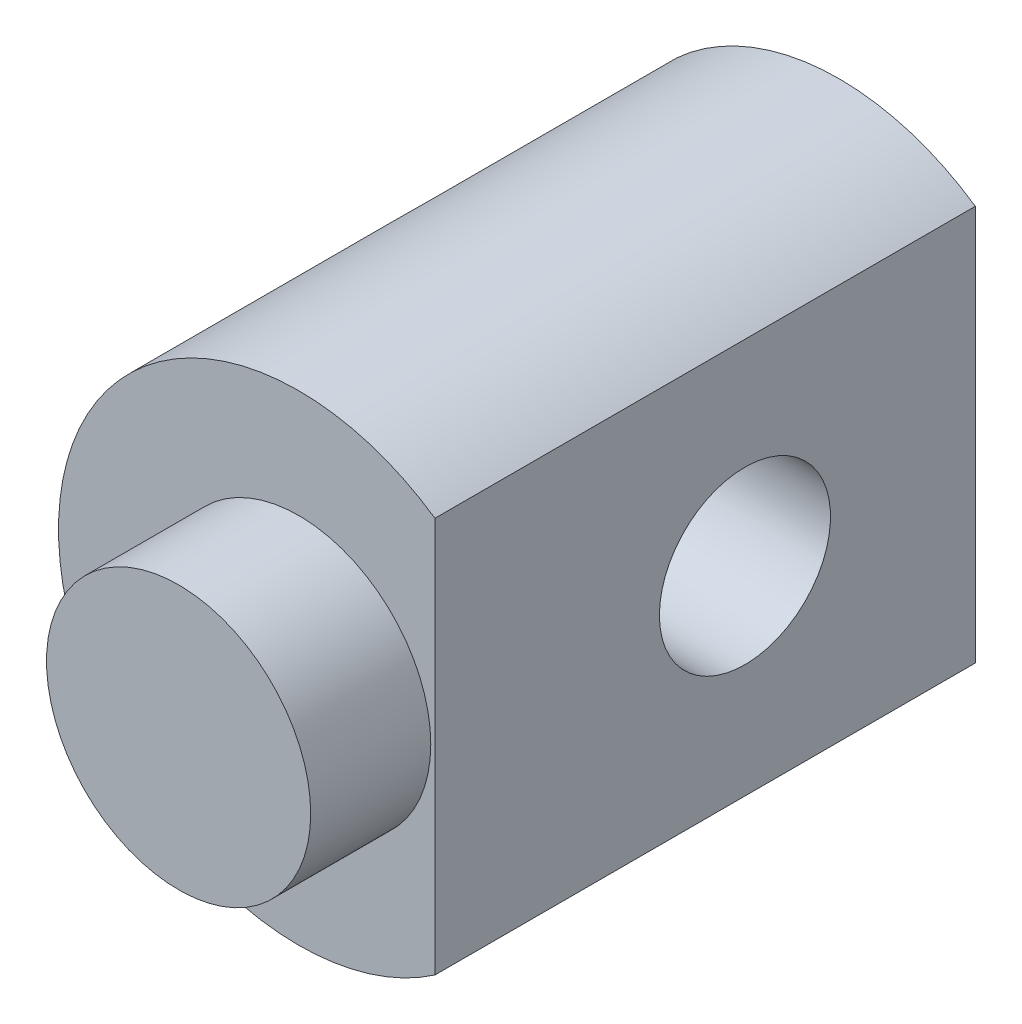
ISO-10303-21;
HEADER;
FILE_DESCRIPTION(('STEP AP214'),'2;1');
FILE_NAME('part.step','',(''),(''),'','','');
FILE_SCHEMA(('AUTOMOTIVE_DESIGN { 1 0 10303 214 1 1 1 1 }'));
ENDSEC;
DATA;
#1=APPLICATION_CONTEXT('core data for automotive mechanical design processes');
#2=APPLICATION_PROTOCOL_DEFINITION('international standard','automotive_design',2000,#1);
#3=PRODUCT_CONTEXT('',#1,'mechanical');
#4=PRODUCT('Part','Part','',(#3));
#5=PRODUCT_RELATED_PRODUCT_CATEGORY('part','',(#4));
#6=PRODUCT_DEFINITION_FORMATION('','',#4);
#7=PRODUCT_DEFINITION_CONTEXT('part definition',#1,'design');
#8=PRODUCT_DEFINITION('design','',#6,#7);
#9=PRODUCT_DEFINITION_SHAPE('','',#8);
#10=(LENGTH_UNIT() NAMED_UNIT(*) SI_UNIT(.MILLI.,.METRE.));
#11=(NAMED_UNIT(*) PLANE_ANGLE_UNIT() SI_UNIT($,.RADIAN.));
#12=(NAMED_UNIT(*) SI_UNIT($,.STERADIAN.) SOLID_ANGLE_UNIT());
#13=UNCERTAINTY_MEASURE_WITH_UNIT(LENGTH_MEASURE(1.E-05),#10,'distance_accuracy_value','');
#14=(GEOMETRIC_REPRESENTATION_CONTEXT(3) GLOBAL_UNCERTAINTY_ASSIGNED_CONTEXT((#13)) GLOBAL_UNIT_ASSIGNED_CONTEXT((#10,
#11,#12)) REPRESENTATION_CONTEXT('',''));
#15=CARTESIAN_POINT('',(0.,0.,0.));
#16=DIRECTION('',(0.,0.,1.));
#17=DIRECTION('',(1.,0.,0.));
#18=AXIS2_PLACEMENT_3D('',#15,#16,#17);
#19=CARTESIAN_POINT('',(0.,0.,-45.));
#20=DIRECTION('',(0.,0.,1.));
#21=DIRECTION('',(1.,0.,0.));
#22=AXIS2_PLACEMENT_3D('',#19,#20,#21);
#23=CYLINDRICAL_SURFACE('',#22,20.);
#24=CARTESIAN_POINT('',(0.,0.,-45.));
#25=DIRECTION('',(0.,0.,-1.));
#26=DIRECTION('',(-1.,0.,0.));
#27=AXIS2_PLACEMENT_3D('',#24,#25,#26);
#28=CIRCLE('',#27,20.);
#29=CARTESIAN_POINT('',(11.3463869978225,-16.4699575620475,-45.));
#30=VERTEX_POINT('',#29);
#31=CARTESIAN_POINT('',(-13.7749773139559,-14.5,-45.));
#32=VERTEX_POINT('',#31);
#33=EDGE_CURVE('E113',#30,#32,#28,.T.);
#34=ORIENTED_EDGE('',*,*,#33,.F.);
#35=DIRECTION('',(0.,0.,-1.));
#36=VECTOR('',#35,1.);
#37=CARTESIAN_POINT('',(11.3463869978225,-16.4699575620475,34.0576427013678));
#38=LINE('',#37,#36);
#39=CARTESIAN_POINT('',(11.3463869978225,-16.4699575620475,0.));
#40=VERTEX_POINT('',#39);
#41=EDGE_CURVE('E97',#40,#30,#38,.T.);
#42=ORIENTED_EDGE('',*,*,#41,.F.);
#43=CARTESIAN_POINT('',(0.,0.,0.));
#44=DIRECTION('',(0.,0.,-1.));
#45=DIRECTION('',(-1.,0.,0.));
#46=AXIS2_PLACEMENT_3D('',#43,#44,#45);
#47=CIRCLE('',#46,20.);
#48=CARTESIAN_POINT('',(11.3463869978225,16.4699575620475,0.));
#49=VERTEX_POINT('',#48);
#50=EDGE_CURVE('E123',#40,#49,#47,.T.);
#51=ORIENTED_EDGE('',*,*,#50,.T.);
#52=DIRECTION('',(0.,0.,-1.));
#53=VECTOR('',#52,1.);
#54=CARTESIAN_POINT('',(11.3463869978225,16.4699575620475,34.0576427013678));
#55=LINE('',#54,#53);
#56=CARTESIAN_POINT('',(11.3463869978225,16.4699575620475,-45.));
#57=VERTEX_POINT('',#56);
#58=EDGE_CURVE('E60',#49,#57,#55,.T.);
#59=ORIENTED_EDGE('',*,*,#58,.T.);
#60=CARTESIAN_POINT('',(-13.5069426592401,14.75,-45.));
#61=VERTEX_POINT('',#60);
#62=EDGE_CURVE('E117',#61,#57,#28,.T.);
#63=ORIENTED_EDGE('',*,*,#62,.F.);
#64=DIRECTION('',(0.,0.,1.));
#65=VECTOR('',#64,1.);
#66=CARTESIAN_POINT('',(-13.5069426592401,14.75,-45.));
#67=LINE('',#66,#65);
#68=CARTESIAN_POINT('',(-13.5069426592401,14.75,-25.4416769971739));
#69=VERTEX_POINT('',#68);
#70=EDGE_CURVE('E128',#69,#61,#67,.F.);
#71=ORIENTED_EDGE('',*,*,#70,.F.);
#72=CARTESIAN_POINT('',(-13.5069426592401,14.75,-25.4416769971739));
#73=CARTESIAN_POINT('',(-13.5069309907166,14.7500037874578,-25.2682630904918));
#74=CARTESIAN_POINT('',(-13.5103127810082,14.7469146294813,-25.0948825403329));
#75=CARTESIAN_POINT('',(-13.5237495524516,14.7345960813234,-24.7486245572327));
#76=CARTESIAN_POINT('',(-13.5338035145862,14.7253676287743,-24.5757470515122));
#77=CARTESIAN_POINT('',(-13.5737461354179,14.6885942847327,-24.0592013116718));
#78=CARTESIAN_POINT('',(-13.6134165345954,14.651960967941,-23.7168547711243));
#79=CARTESIAN_POINT('',(-13.7159753559167,14.5559890034906,-23.0434362882866));
#80=CARTESIAN_POINT('',(-13.778571911205,14.4969354502127,-22.7122774286713));
#81=CARTESIAN_POINT('',(-13.9239720130985,14.3573373720013,-22.0589512119839));
#82=CARTESIAN_POINT('',(-14.0067844582275,14.2767833816572,-21.7367878842988));
#83=CARTESIAN_POINT('',(-14.1884645167596,14.0962308503194,-21.1055104565011));
#84=CARTESIAN_POINT('',(-14.2872063197504,13.996383556286,-20.7963162587408));
#85=CARTESIAN_POINT('',(-14.4978340547991,13.7780912489034,-20.1892709822596));
#86=CARTESIAN_POINT('',(-14.6097188189615,13.6596478877035,-19.8914188987779));
#87=CARTESIAN_POINT('',(-14.8439420697845,13.4047542032491,-19.3064594212635));
#88=CARTESIAN_POINT('',(-14.9663146230803,13.2682443496115,-19.0193917618894));
#89=CARTESIAN_POINT('',(-15.2183986270659,12.9783380186441,-18.4572398449629));
#90=CARTESIAN_POINT('',(-15.3481111831917,12.8249389944248,-18.1821574035371));
#91=CARTESIAN_POINT('',(-15.6385251284159,12.4699234219939,-17.5908946179409));
#92=CARTESIAN_POINT('',(-15.8002803227312,12.2647716524342,-17.2773503402798));
#93=CARTESIAN_POINT('',(-16.1269605432795,11.8319353985723,-16.6679676750033));
#94=CARTESIAN_POINT('',(-16.291885812621,11.6042491805354,-16.3721306525467));
#95=CARTESIAN_POINT('',(-16.6216429042399,11.1267786761317,-15.7985034293293));
#96=CARTESIAN_POINT('',(-16.7864746434948,10.8769838204442,-15.5207219715254));
#97=CARTESIAN_POINT('',(-17.1129063107715,10.3558203025214,-14.9841033433854));
#98=CARTESIAN_POINT('',(-17.2745059797999,10.0844499199873,-14.7252676868365));
#99=CARTESIAN_POINT('',(-17.6229147673263,9.46482346514803,-14.1784125393595));
#100=CARTESIAN_POINT('',(-17.8083987606098,9.11196807653096,-13.8947265737863));
#101=CARTESIAN_POINT('',(-18.1658035692644,8.3767930785679,-13.3584007219608));
#102=CARTESIAN_POINT('',(-18.3377214648815,7.99446716126014,-13.1057675125271));
#103=CARTESIAN_POINT('',(-18.6629642923903,7.20254747961001,-12.6350079755061));
#104=CARTESIAN_POINT('',(-18.8163191661097,6.79299932325721,-12.4168259009498));
#105=CARTESIAN_POINT('',(-19.1000816690428,5.94852915487544,-12.018007973746));
#106=CARTESIAN_POINT('',(-19.2305007142784,5.51361991037375,-11.8373534340767));
#107=CARTESIAN_POINT('',(-19.4300273925626,4.75192814222806,-11.5638197261224));
#108=CARTESIAN_POINT('',(-19.5059276237335,4.43055894771717,-11.4607018941078));
#109=CARTESIAN_POINT('',(-19.6426519645356,3.77850410855573,-11.2763234710872));
#110=CARTESIAN_POINT('',(-19.7034795543552,3.44782063419479,-11.1950578341623));
#111=CARTESIAN_POINT('',(-19.8088324574233,2.77931350308201,-11.0555113222804));
#112=CARTESIAN_POINT('',(-19.8533688441261,2.44149486206515,-10.9972148326516));
#113=CARTESIAN_POINT('',(-19.925280548476,1.76077268053772,-10.9043848795458));
#114=CARTESIAN_POINT('',(-19.9526552689898,1.41786896351888,-10.8698522429185));
#115=CARTESIAN_POINT('',(-19.9897092700305,0.728643503446874,-10.8250495621184));
#116=CARTESIAN_POINT('',(-19.9993434477124,0.38231529278248,-10.8148413400644));
#117=CARTESIAN_POINT('',(-20.0005915848015,-0.310222334253451,-10.8190537005763));
#118=CARTESIAN_POINT('',(-19.9922056108916,-0.656431751059839,-10.8334741920043));
#119=CARTESIAN_POINT('',(-19.9576346693823,-1.34613201343262,-10.8867445711918));
#120=CARTESIAN_POINT('',(-19.931446083502,-1.68962229198955,-10.9255994249778));
#121=CARTESIAN_POINT('',(-19.8618838038995,-2.37127618895916,-11.0271711966312));
#122=CARTESIAN_POINT('',(-19.8185102137275,-2.70943983945533,-11.0898879707157));
#123=CARTESIAN_POINT('',(-19.7172510407582,-3.36704812964666,-11.235836964512));
#124=CARTESIAN_POINT('',(-19.6598943379289,-3.6867416584013,-11.3183199731246));
#125=CARTESIAN_POINT('',(-19.5311359942428,-4.3172037126334,-11.5037638109905));
#126=CARTESIAN_POINT('',(-19.4597347647275,-4.62797249919682,-11.6067240404998));
#127=CARTESIAN_POINT('',(-19.3041742123059,-5.23911221826653,-11.8320112311368));
#128=CARTESIAN_POINT('',(-19.2200143331264,-5.53948269670819,-11.9543390366949));
#129=CARTESIAN_POINT('',(-19.0403394801753,-6.12865023399151,-12.2172084396934));
#130=CARTESIAN_POINT('',(-18.9448229789222,-6.41744572898115,-12.3577524874733));
#131=CARTESIAN_POINT('',(-18.7331770385915,-7.01271957313139,-12.6718446572816));
#132=CARTESIAN_POINT('',(-18.6159356029466,-7.31778824350217,-12.8473148144056));
#133=CARTESIAN_POINT('',(-18.3714202109486,-7.91164082982286,-13.2177037086128));
#134=CARTESIAN_POINT('',(-18.2441456503072,-8.20042376309434,-13.4126236173293));
#135=CARTESIAN_POINT('',(-17.9815663899984,-8.76123262267454,-13.8207539593196));
#136=CARTESIAN_POINT('',(-17.8462561620122,-9.03324674403899,-14.0339770306617));
#137=CARTESIAN_POINT('',(-17.5698044526013,-9.55983397288082,-14.4775015595131));
#138=CARTESIAN_POINT('',(-17.4286624209553,-9.81440542861954,-14.7078046301301));
#139=CARTESIAN_POINT('',(-17.1157541588719,-10.352055401592,-15.2295521693027));
#140=CARTESIAN_POINT('',(-16.9432311028973,-10.6314597871608,-15.5243377613093));
#141=CARTESIAN_POINT('',(-16.5968188817059,-11.1645271609775,-16.1356721041295));
#142=CARTESIAN_POINT('',(-16.4229294557366,-11.4181851006873,-16.4522251029095));
#143=CARTESIAN_POINT('',(-16.0778411027061,-11.8991885321547,-17.1065394258211));
#144=CARTESIAN_POINT('',(-15.906644205745,-12.1265149220867,-17.4443158755781));
#145=CARTESIAN_POINT('',(-15.5717668451243,-12.5536317094692,-18.1403359204367));
#146=CARTESIAN_POINT('',(-15.4080844989762,-12.7534290286715,-18.4985743385365));
#147=CARTESIAN_POINT('',(-15.1255365865987,-13.0864702983484,-19.1603072669128));
#148=CARTESIAN_POINT('',(-15.0043194122239,-13.2249904533387,-19.4601479006566));
#149=CARTESIAN_POINT('',(-14.7731442537638,-13.482736099618,-20.0722819420442));
#150=CARTESIAN_POINT('',(-14.663186294768,-13.601961547912,-20.384575377435));
#151=CARTESIAN_POINT('',(-14.4583505722138,-13.8194915630199,-21.0196866481147));
#152=CARTESIAN_POINT('',(-14.3634141235265,-13.9178780796512,-21.3424572756608));
#153=CARTESIAN_POINT('',(-14.1916696472506,-14.0929625149915,-21.9985238184719));
#154=CARTESIAN_POINT('',(-14.1148550157977,-14.1696683364988,-22.331815849221));
#155=CARTESIAN_POINT('',(-14.0048294524251,-14.278254634662,-22.8942542552946));
#156=CARTESIAN_POINT('',(-13.965623387757,-14.3165503061141,-23.1210142456887));
#157=CARTESIAN_POINT('',(-13.8976448787151,-14.3825486616177,-23.5775853991649));
#158=CARTESIAN_POINT('',(-13.8688697484431,-14.4102540726931,-23.8073957609745));
#159=CARTESIAN_POINT('',(-13.8223278636541,-14.4549078986615,-24.2706338607703));
#160=CARTESIAN_POINT('',(-13.8046307327214,-14.4717882958271,-24.5040752103893));
#161=CARTESIAN_POINT('',(-13.7809245438579,-14.4943495174548,-24.9722281381743));
#162=CARTESIAN_POINT('',(-13.7749225743057,-14.5000235498238,-25.2069404002786));
#163=CARTESIAN_POINT('',(-13.7749773139559,-14.5,-25.4416769971739));
#164=B_SPLINE_CURVE_WITH_KNOTS('',3,(#72,#73,#74,#75,#76,#77,#78,#79,#80,#81,#82,#83,#84,#85,
#86,#87,#88,#89,#90,#91,#92,#93,#94,#95,#96,#97,#98,#99,#100,#101,#102,#103,#104,#105,#106,#107,
#108,#109,#110,#111,#112,#113,#114,#115,#116,#117,#118,#119,#120,#121,#122,#123,#124,#125,#126,
#127,#128,#129,#130,#131,#132,#133,#134,#135,#136,#137,#138,#139,#140,#141,#142,#143,#144,#145,
#146,#147,#148,#149,#150,#151,#152,#153,#154,#155,#156,#157,#158,#159,#160,#161,#162,#163),
.UNSPECIFIED.,.F.,.F.,(4,2,2,2,2,2,2,2,2,2,2,2,2,2,2,2,2,2,2,2,2,2,2,2,2,2,2,2,2,2,2,2,2,2,2,2,
2,2,2,2,2,2,2,2,2,4),(0.,0.520116715963209,1.04015401461035,2.07794468194586,3.10295836629843,
4.12842405190123,5.14615497512612,6.1637955301592,7.184876892897,8.20611244631222,
9.42938872510723,10.6527591924754,11.8767176999854,13.1007738964132,14.5666000285142,
16.0327407864163,17.4964842491002,18.9594970769681,19.9962726446823,21.0328086032054,
22.0686386926659,23.1045048214177,24.1430008778349,25.1814930913409,26.2201964356823,
27.2588935212815,28.2631492443394,29.2673755587379,30.2716456696793,31.2760510094831,
32.3878212074823,33.4996584178756,34.6122696079868,35.7249860119643,37.0474860042853,
38.3702448224411,39.6939572846955,41.0173363105322,42.0720074999036,43.1266810393921,
44.1771266988063,45.2271889665759,45.92661634449,46.6258634962286,47.3294623166881,
48.0334874523731),.UNSPECIFIED.);
#165=CARTESIAN_POINT('',(-13.7749773139559,-14.5,-25.4416769971739));
#166=VERTEX_POINT('',#165);
#167=EDGE_CURVE('E11',#69,#166,#164,.T.);
#168=ORIENTED_EDGE('',*,*,#167,.T.);
#169=DIRECTION('',(0.,0.,1.));
#170=VECTOR('',#169,1.);
#171=CARTESIAN_POINT('',(-13.7749773139559,-14.5,-45.));
#172=LINE('',#171,#170);
#173=EDGE_CURVE('E121',#166,#32,#172,.F.);
#174=ORIENTED_EDGE('',*,*,#173,.T.);
#175=EDGE_LOOP('',(#34,#42,#51,#59,#63,#71,#168,#174));
#176=FACE_BOUND('',#175,.T.);
#177=ADVANCED_FACE('F43',(#176),#23,.T.);
#178=CARTESIAN_POINT('',(0.,0.,-45.));
#179=DIRECTION('',(0.,0.,-1.));
#180=DIRECTION('',(-1.,0.,0.));
#181=AXIS2_PLACEMENT_3D('',#178,#179,#180);
#182=PLANE('',#181);
#183=DIRECTION('',(0.,1.,0.));
#184=VECTOR('',#183,1.);
#185=CARTESIAN_POINT('',(11.3463869978225,16.4699575620475,-45.));
#186=LINE('',#185,#184);
#187=EDGE_CURVE('E101',#30,#57,#186,.T.);
#188=ORIENTED_EDGE('',*,*,#187,.F.);
#189=ORIENTED_EDGE('',*,*,#33,.T.);
#190=DIRECTION('',(-1.,0.,0.));
#191=VECTOR('',#190,1.);
#192=CARTESIAN_POINT('',(0.,-14.5,-45.));
#193=LINE('',#192,#191);
#194=CARTESIAN_POINT('',(0.,-14.5,-45.));
#195=VERTEX_POINT('',#194);
#196=EDGE_CURVE('E143',#195,#32,#193,.T.);
#197=ORIENTED_EDGE('',*,*,#196,.F.);
#198=DIRECTION('',(0.,-1.,0.));
#199=VECTOR('',#198,1.);
#200=CARTESIAN_POINT('',(0.,0.,-45.));
#201=LINE('',#200,#199);
#202=CARTESIAN_POINT('',(0.,14.75,-45.));
#203=VERTEX_POINT('',#202);
#204=EDGE_CURVE('E137',#203,#195,#201,.T.);
#205=ORIENTED_EDGE('',*,*,#204,.F.);
#206=DIRECTION('',(-1.,0.,0.));
#207=VECTOR('',#206,1.);
#208=CARTESIAN_POINT('',(0.,14.75,-45.));
#209=LINE('',#208,#207);
#210=EDGE_CURVE('E53',#203,#61,#209,.T.);
#211=ORIENTED_EDGE('',*,*,#210,.T.);
#212=ORIENTED_EDGE('',*,*,#62,.T.);
#213=EDGE_LOOP('',(#188,#189,#197,#205,#211,#212));
#214=FACE_BOUND('',#213,.T.);
#215=ADVANCED_FACE('F111',(#214),#182,.T.);
#216=CARTESIAN_POINT('',(0.,0.,10.));
#217=DIRECTION('',(0.,0.,-1.));
#218=DIRECTION('',(-1.,0.,0.));
#219=AXIS2_PLACEMENT_3D('',#216,#217,#218);
#220=CYLINDRICAL_SURFACE('',#219,11.);
#221=CARTESIAN_POINT('',(0.,0.,10.));
#222=DIRECTION('',(0.,0.,1.));
#223=DIRECTION('',(1.,0.,0.));
#224=AXIS2_PLACEMENT_3D('',#221,#222,#223);
#225=CIRCLE('',#224,11.);
#226=CARTESIAN_POINT('',(11.,0.,10.));
#227=VERTEX_POINT('',#226);
#228=EDGE_CURVE('E133',#227,#227,#225,.T.);
#229=ORIENTED_EDGE('',*,*,#228,.F.);
#230=EDGE_LOOP('',(#229));
#231=FACE_BOUND('',#230,.T.);
#232=CARTESIAN_POINT('',(0.,0.,0.));
#233=DIRECTION('',(0.,0.,1.));
#234=DIRECTION('',(1.,0.,0.));
#235=AXIS2_PLACEMENT_3D('',#232,#233,#234);
#236=CIRCLE('',#235,11.);
#237=CARTESIAN_POINT('',(11.,0.,0.));
#238=VERTEX_POINT('',#237);
#239=EDGE_CURVE('E127',#238,#238,#236,.T.);
#240=ORIENTED_EDGE('',*,*,#239,.T.);
#241=EDGE_LOOP('',(#240));
#242=FACE_BOUND('',#241,.T.);
#243=ADVANCED_FACE('F45',(#231,#242),#220,.T.);
#244=CARTESIAN_POINT('',(0.,0.,10.));
#245=DIRECTION('',(0.,0.,1.));
#246=DIRECTION('',(1.,0.,0.));
#247=AXIS2_PLACEMENT_3D('',#244,#245,#246);
#248=PLANE('',#247);
#249=ORIENTED_EDGE('',*,*,#228,.T.);
#250=EDGE_LOOP('',(#249));
#251=FACE_BOUND('',#250,.T.);
#252=ADVANCED_FACE('F170',(#251),#248,.T.);
#253=CARTESIAN_POINT('',(0.,0.,0.));
#254=DIRECTION('',(0.,0.,-1.));
#255=DIRECTION('',(-1.,0.,0.));
#256=AXIS2_PLACEMENT_3D('',#253,#254,#255);
#257=PLANE('',#256);
#258=ORIENTED_EDGE('',*,*,#239,.F.);
#259=EDGE_LOOP('',(#258));
#260=FACE_BOUND('',#259,.T.);
#261=ORIENTED_EDGE('',*,*,#50,.F.);
#262=DIRECTION('',(0.,-1.,0.));
#263=VECTOR('',#262,1.);
#264=CARTESIAN_POINT('',(11.3463869978225,16.4699575620475,0.));
#265=LINE('',#264,#263);
#266=EDGE_CURVE('E102',#49,#40,#265,.T.);
#267=ORIENTED_EDGE('',*,*,#266,.F.);
#268=EDGE_LOOP('',(#261,#267));
#269=FACE_BOUND('',#268,.T.);
#270=ADVANCED_FACE('F161',(#260,#269),#257,.F.);
#271=CARTESIAN_POINT('',(-20.,0.125000000000002,-25.4416769971739));
#272=DIRECTION('',(1.,0.,0.));
#273=DIRECTION('',(0.,0.,-1.));
#274=AXIS2_PLACEMENT_3D('',#271,#272,#273);
#275=CYLINDRICAL_SURFACE('',#274,14.625);
#276=DIRECTION('',(1.,0.,0.));
#277=VECTOR('',#276,1.);
#278=CARTESIAN_POINT('',(-20.,14.75,-25.4416769971739));
#279=LINE('',#278,#277);
#280=CARTESIAN_POINT('',(0.,14.75,-25.4416769971739));
#281=VERTEX_POINT('',#280);
#282=EDGE_CURVE('E299',#69,#281,#279,.T.);
#283=ORIENTED_EDGE('',*,*,#282,.T.);
#284=CARTESIAN_POINT('',(0.,0.125000000000002,-25.4416769971739));
#285=DIRECTION('',(1.,0.,0.));
#286=DIRECTION('',(0.,0.,-1.));
#287=AXIS2_PLACEMENT_3D('',#284,#285,#286);
#288=CIRCLE('',#287,14.625);
#289=CARTESIAN_POINT('',(0.,-14.5,-25.4416769971739));
#290=VERTEX_POINT('',#289);
#291=EDGE_CURVE('E288',#281,#290,#288,.T.);
#292=ORIENTED_EDGE('',*,*,#291,.T.);
#293=DIRECTION('',(1.,0.,0.));
#294=VECTOR('',#293,1.);
#295=CARTESIAN_POINT('',(-20.,-14.5,-25.4416769971739));
#296=LINE('',#295,#294);
#297=EDGE_CURVE('E300',#166,#290,#296,.T.);
#298=ORIENTED_EDGE('',*,*,#297,.F.);
#299=ORIENTED_EDGE('',*,*,#167,.F.);
#300=EDGE_LOOP('',(#283,#292,#298,#299));
#301=FACE_BOUND('',#300,.T.);
#302=ADVANCED_FACE('F155',(#301),#275,.F.);
#303=CARTESIAN_POINT('',(-20.,14.75,0.));
#304=DIRECTION('',(0.,-1.,0.));
#305=DIRECTION('',(0.,0.,-1.));
#306=AXIS2_PLACEMENT_3D('',#303,#304,#305);
#307=PLANE('',#306);
#308=ORIENTED_EDGE('',*,*,#70,.T.);
#309=ORIENTED_EDGE('',*,*,#210,.F.);
#310=DIRECTION('',(0.,0.,-1.));
#311=VECTOR('',#310,1.);
#312=CARTESIAN_POINT('',(0.,14.75,0.));
#313=LINE('',#312,#311);
#314=EDGE_CURVE('E68',#281,#203,#313,.T.);
#315=ORIENTED_EDGE('',*,*,#314,.F.);
#316=ORIENTED_EDGE('',*,*,#282,.F.);
#317=EDGE_LOOP('',(#308,#309,#315,#316));
#318=FACE_BOUND('',#317,.T.);
#319=ADVANCED_FACE('F160',(#318),#307,.T.);
#320=CARTESIAN_POINT('',(-20.,-14.5,0.));
#321=DIRECTION('',(0.,-1.,0.));
#322=DIRECTION('',(0.,0.,-1.));
#323=AXIS2_PLACEMENT_3D('',#320,#321,#322);
#324=PLANE('',#323);
#325=ORIENTED_EDGE('',*,*,#297,.T.);
#326=DIRECTION('',(0.,0.,-1.));
#327=VECTOR('',#326,1.);
#328=CARTESIAN_POINT('',(0.,-14.5,0.));
#329=LINE('',#328,#327);
#330=EDGE_CURVE('E295',#290,#195,#329,.T.);
#331=ORIENTED_EDGE('',*,*,#330,.T.);
#332=ORIENTED_EDGE('',*,*,#196,.T.);
#333=ORIENTED_EDGE('',*,*,#173,.F.);
#334=EDGE_LOOP('',(#325,#331,#332,#333));
#335=FACE_BOUND('',#334,.T.);
#336=ADVANCED_FACE('F163',(#335),#324,.F.);
#337=CARTESIAN_POINT('',(0.,0.,0.));
#338=DIRECTION('',(1.,0.,0.));
#339=DIRECTION('',(0.,0.,-1.));
#340=AXIS2_PLACEMENT_3D('',#337,#338,#339);
#341=PLANE('',#340);
#342=CARTESIAN_POINT('',(0.,0.125000000000002,-25.8166769971739));
#343=DIRECTION('',(-1.,0.,0.));
#344=DIRECTION('',(0.,0.,1.));
#345=AXIS2_PLACEMENT_3D('',#342,#343,#344);
#346=CIRCLE('',#345,7.125);
#347=CARTESIAN_POINT('',(0.,0.125000000000002,-18.6916769971739));
#348=VERTEX_POINT('',#347);
#349=EDGE_CURVE('E283',#348,#348,#346,.T.);
#350=ORIENTED_EDGE('',*,*,#349,.F.);
#351=EDGE_LOOP('',(#350));
#352=FACE_BOUND('',#351,.T.);
#353=ORIENTED_EDGE('',*,*,#204,.T.);
#354=ORIENTED_EDGE('',*,*,#330,.F.);
#355=ORIENTED_EDGE('',*,*,#291,.F.);
#356=ORIENTED_EDGE('',*,*,#314,.T.);
#357=EDGE_LOOP('',(#353,#354,#355,#356));
#358=FACE_BOUND('',#357,.T.);
#359=ADVANCED_FACE('F221',(#352,#358),#341,.F.);
#360=CARTESIAN_POINT('',(20.,0.125000000000002,-25.8166769971739));
#361=DIRECTION('',(-1.,0.,0.));
#362=DIRECTION('',(0.,0.,1.));
#363=AXIS2_PLACEMENT_3D('',#360,#361,#362);
#364=CYLINDRICAL_SURFACE('',#363,7.125);
#365=CARTESIAN_POINT('',(11.3463869978225,0.125000000000002,-25.8166769971739));
#366=DIRECTION('',(-1.,0.,0.));
#367=DIRECTION('',(0.,0.,1.));
#368=AXIS2_PLACEMENT_3D('',#365,#366,#367);
#369=CIRCLE('',#368,7.125);
#370=CARTESIAN_POINT('',(11.3463869978225,0.125000000000002,-18.6916769971739));
#371=VERTEX_POINT('',#370);
#372=EDGE_CURVE('E47',#371,#371,#369,.F.);
#373=ORIENTED_EDGE('',*,*,#372,.T.);
#374=EDGE_LOOP('',(#373));
#375=FACE_BOUND('',#374,.T.);
#376=ORIENTED_EDGE('',*,*,#349,.T.);
#377=EDGE_LOOP('',(#376));
#378=FACE_BOUND('',#377,.T.);
#379=ADVANCED_FACE('F230',(#375,#378),#364,.F.);
#380=CARTESIAN_POINT('',(11.3463869978225,16.4699575620475,34.0576427013678));
#381=DIRECTION('',(-1.,0.,0.));
#382=DIRECTION('',(0.,0.,1.));
#383=AXIS2_PLACEMENT_3D('',#380,#381,#382);
#384=PLANE('',#383);
#385=ORIENTED_EDGE('',*,*,#266,.T.);
#386=ORIENTED_EDGE('',*,*,#41,.T.);
#387=ORIENTED_EDGE('',*,*,#187,.T.);
#388=ORIENTED_EDGE('',*,*,#58,.F.);
#389=EDGE_LOOP('',(#385,#386,#387,#388));
#390=FACE_BOUND('',#389,.T.);
#391=ORIENTED_EDGE('',*,*,#372,.F.);
#392=EDGE_LOOP('',(#391));
#393=FACE_BOUND('',#392,.T.);
#394=ADVANCED_FACE('F99',(#390,#393),#384,.F.);
#395=CLOSED_SHELL('',(#177,#215,#243,#252,#270,#302,#319,#336,#359,#379,#394));
#396=MANIFOLD_SOLID_BREP('B2',#395);
#397=ADVANCED_BREP_SHAPE_REPRESENTATION('',(#18,#396),#14);
#398=SHAPE_DEFINITION_REPRESENTATION(#9,#397);
ENDSEC;
END-ISO-10303-21;
